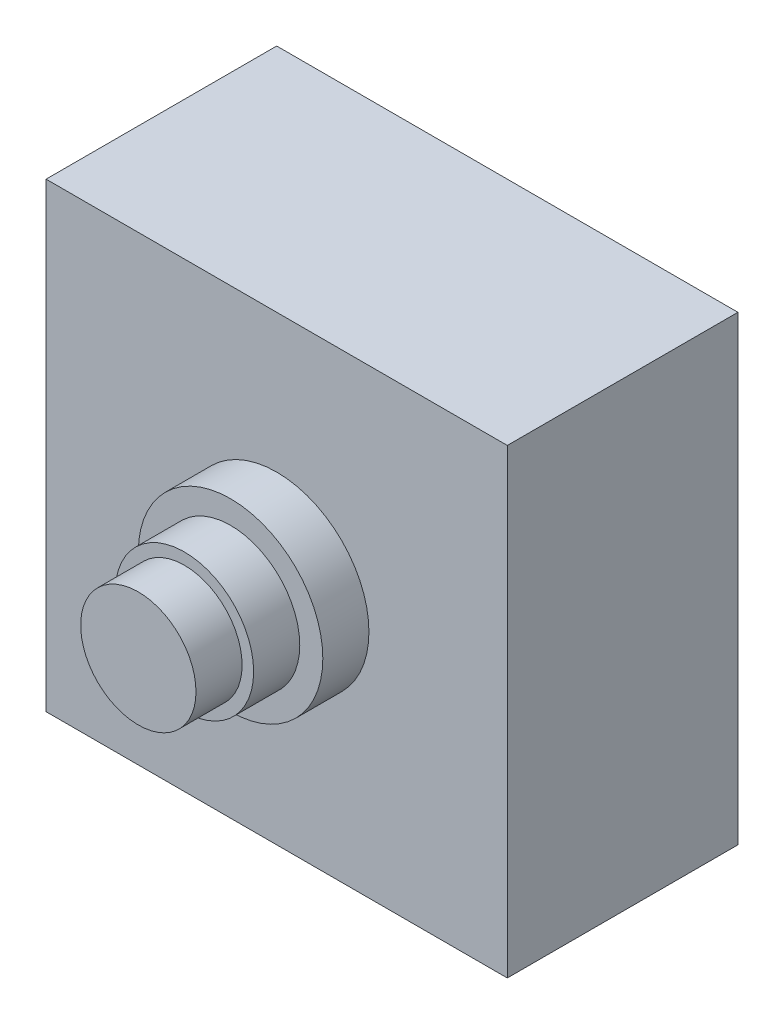
ISO-10303-21;
HEADER;
FILE_DESCRIPTION(('STEP AP214'),'2;1');
FILE_NAME('part.step','',(''),(''),'','','');
FILE_SCHEMA(('AUTOMOTIVE_DESIGN { 1 0 10303 214 1 1 1 1 }'));
ENDSEC;
DATA;
#1=APPLICATION_CONTEXT('core data for automotive mechanical design processes');
#2=APPLICATION_PROTOCOL_DEFINITION('international standard','automotive_design',2000,#1);
#3=PRODUCT_CONTEXT('',#1,'mechanical');
#4=PRODUCT('Part','Part','',(#3));
#5=PRODUCT_RELATED_PRODUCT_CATEGORY('part','',(#4));
#6=PRODUCT_DEFINITION_FORMATION('','',#4);
#7=PRODUCT_DEFINITION_CONTEXT('part definition',#1,'design');
#8=PRODUCT_DEFINITION('design','',#6,#7);
#9=PRODUCT_DEFINITION_SHAPE('','',#8);
#10=(LENGTH_UNIT() NAMED_UNIT(*) SI_UNIT(.MILLI.,.METRE.));
#11=(NAMED_UNIT(*) PLANE_ANGLE_UNIT() SI_UNIT($,.RADIAN.));
#12=(NAMED_UNIT(*) SI_UNIT($,.STERADIAN.) SOLID_ANGLE_UNIT());
#13=UNCERTAINTY_MEASURE_WITH_UNIT(LENGTH_MEASURE(1.E-05),#10,'distance_accuracy_value','');
#14=(GEOMETRIC_REPRESENTATION_CONTEXT(3) GLOBAL_UNCERTAINTY_ASSIGNED_CONTEXT((#13)) GLOBAL_UNIT_ASSIGNED_CONTEXT((#10,
#11,#12)) REPRESENTATION_CONTEXT('',''));
#15=CARTESIAN_POINT('',(0.,0.,0.));
#16=DIRECTION('',(0.,0.,1.));
#17=DIRECTION('',(1.,0.,0.));
#18=AXIS2_PLACEMENT_3D('',#15,#16,#17);
#19=CARTESIAN_POINT('',(100.,-100.,100.));
#20=DIRECTION('',(-1.,0.,0.));
#21=DIRECTION('',(0.,0.,1.));
#22=AXIS2_PLACEMENT_3D('',#19,#20,#21);
#23=PLANE('',#22);
#24=DIRECTION('',(0.,1.,0.));
#25=VECTOR('',#24,1.);
#26=CARTESIAN_POINT('',(100.,-100.,0.));
#27=LINE('',#26,#25);
#28=CARTESIAN_POINT('',(100.,-100.,0.));
#29=VERTEX_POINT('',#28);
#30=CARTESIAN_POINT('',(100.,100.,0.));
#31=VERTEX_POINT('',#30);
#32=EDGE_CURVE('E106',#29,#31,#27,.T.);
#33=ORIENTED_EDGE('',*,*,#32,.T.);
#34=DIRECTION('',(0.,0.,-1.));
#35=VECTOR('',#34,1.);
#36=CARTESIAN_POINT('',(100.,100.,100.));
#37=LINE('',#36,#35);
#38=CARTESIAN_POINT('',(100.,100.,100.));
#39=VERTEX_POINT('',#38);
#40=EDGE_CURVE('E45',#39,#31,#37,.T.);
#41=ORIENTED_EDGE('',*,*,#40,.F.);
#42=DIRECTION('',(0.,1.,0.));
#43=VECTOR('',#42,1.);
#44=CARTESIAN_POINT('',(100.,-100.,100.));
#45=LINE('',#44,#43);
#46=CARTESIAN_POINT('',(100.,-100.,100.));
#47=VERTEX_POINT('',#46);
#48=EDGE_CURVE('E91',#47,#39,#45,.T.);
#49=ORIENTED_EDGE('',*,*,#48,.F.);
#50=DIRECTION('',(0.,0.,-1.));
#51=VECTOR('',#50,1.);
#52=CARTESIAN_POINT('',(100.,-100.,100.));
#53=LINE('',#52,#51);
#54=EDGE_CURVE('E105',#47,#29,#53,.T.);
#55=ORIENTED_EDGE('',*,*,#54,.T.);
#56=EDGE_LOOP('',(#33,#41,#49,#55));
#57=FACE_BOUND('',#56,.T.);
#58=ADVANCED_FACE('F39',(#57),#23,.F.);
#59=CARTESIAN_POINT('',(-100.,100.,100.));
#60=DIRECTION('',(0.,-1.,0.));
#61=DIRECTION('',(0.,0.,-1.));
#62=AXIS2_PLACEMENT_3D('',#59,#60,#61);
#63=PLANE('',#62);
#64=DIRECTION('',(-1.,0.,0.));
#65=VECTOR('',#64,1.);
#66=CARTESIAN_POINT('',(-100.,100.,0.));
#67=LINE('',#66,#65);
#68=CARTESIAN_POINT('',(-100.,100.,0.));
#69=VERTEX_POINT('',#68);
#70=EDGE_CURVE('E98',#31,#69,#67,.T.);
#71=ORIENTED_EDGE('',*,*,#70,.T.);
#72=DIRECTION('',(0.,0.,-1.));
#73=VECTOR('',#72,1.);
#74=CARTESIAN_POINT('',(-100.,100.,100.));
#75=LINE('',#74,#73);
#76=CARTESIAN_POINT('',(-100.,100.,100.));
#77=VERTEX_POINT('',#76);
#78=EDGE_CURVE('E96',#77,#69,#75,.T.);
#79=ORIENTED_EDGE('',*,*,#78,.F.);
#80=DIRECTION('',(-1.,0.,0.));
#81=VECTOR('',#80,1.);
#82=CARTESIAN_POINT('',(-100.,100.,100.));
#83=LINE('',#82,#81);
#84=EDGE_CURVE('E86',#39,#77,#83,.T.);
#85=ORIENTED_EDGE('',*,*,#84,.F.);
#86=ORIENTED_EDGE('',*,*,#40,.T.);
#87=EDGE_LOOP('',(#71,#79,#85,#86));
#88=FACE_BOUND('',#87,.T.);
#89=ADVANCED_FACE('F100',(#88),#63,.F.);
#90=CARTESIAN_POINT('',(-100.,-100.,100.));
#91=DIRECTION('',(1.,0.,0.));
#92=DIRECTION('',(0.,0.,-1.));
#93=AXIS2_PLACEMENT_3D('',#90,#91,#92);
#94=PLANE('',#93);
#95=DIRECTION('',(0.,-1.,0.));
#96=VECTOR('',#95,1.);
#97=CARTESIAN_POINT('',(-100.,-100.,0.));
#98=LINE('',#97,#96);
#99=CARTESIAN_POINT('',(-100.,-100.,0.));
#100=VERTEX_POINT('',#99);
#101=EDGE_CURVE('E74',#69,#100,#98,.T.);
#102=ORIENTED_EDGE('',*,*,#101,.T.);
#103=DIRECTION('',(0.,0.,-1.));
#104=VECTOR('',#103,1.);
#105=CARTESIAN_POINT('',(-100.,-100.,100.));
#106=LINE('',#105,#104);
#107=CARTESIAN_POINT('',(-100.,-100.,100.));
#108=VERTEX_POINT('',#107);
#109=EDGE_CURVE('E97',#108,#100,#106,.T.);
#110=ORIENTED_EDGE('',*,*,#109,.F.);
#111=DIRECTION('',(0.,-1.,0.));
#112=VECTOR('',#111,1.);
#113=CARTESIAN_POINT('',(-100.,-100.,100.));
#114=LINE('',#113,#112);
#115=EDGE_CURVE('E93',#77,#108,#114,.T.);
#116=ORIENTED_EDGE('',*,*,#115,.F.);
#117=ORIENTED_EDGE('',*,*,#78,.T.);
#118=EDGE_LOOP('',(#102,#110,#116,#117));
#119=FACE_BOUND('',#118,.T.);
#120=ADVANCED_FACE('F99',(#119),#94,.F.);
#121=CARTESIAN_POINT('',(-100.,-100.,100.));
#122=DIRECTION('',(0.,1.,0.));
#123=DIRECTION('',(0.,0.,1.));
#124=AXIS2_PLACEMENT_3D('',#121,#122,#123);
#125=PLANE('',#124);
#126=DIRECTION('',(1.,0.,0.));
#127=VECTOR('',#126,1.);
#128=CARTESIAN_POINT('',(-100.,-100.,0.));
#129=LINE('',#128,#127);
#130=EDGE_CURVE('E76',#100,#29,#129,.T.);
#131=ORIENTED_EDGE('',*,*,#130,.T.);
#132=ORIENTED_EDGE('',*,*,#54,.F.);
#133=DIRECTION('',(1.,0.,0.));
#134=VECTOR('',#133,1.);
#135=CARTESIAN_POINT('',(-100.,-100.,100.));
#136=LINE('',#135,#134);
#137=EDGE_CURVE('E60',#108,#47,#136,.T.);
#138=ORIENTED_EDGE('',*,*,#137,.F.);
#139=ORIENTED_EDGE('',*,*,#109,.T.);
#140=EDGE_LOOP('',(#131,#132,#138,#139));
#141=FACE_BOUND('',#140,.T.);
#142=ADVANCED_FACE('F111',(#141),#125,.F.);
#143=CARTESIAN_POINT('',(0.,0.,100.));
#144=DIRECTION('',(0.,0.,-1.));
#145=DIRECTION('',(-1.,0.,0.));
#146=AXIS2_PLACEMENT_3D('',#143,#144,#145);
#147=PLANE('',#146);
#148=CARTESIAN_POINT('',(0.,0.,100.));
#149=DIRECTION('',(0.,0.,1.));
#150=DIRECTION('',(1.,0.,0.));
#151=AXIS2_PLACEMENT_3D('',#148,#149,#150);
#152=CIRCLE('',#151,40.);
#153=CARTESIAN_POINT('',(40.,0.,100.));
#154=VERTEX_POINT('',#153);
#155=EDGE_CURVE('E116',#154,#154,#152,.T.);
#156=ORIENTED_EDGE('',*,*,#155,.F.);
#157=EDGE_LOOP('',(#156));
#158=FACE_BOUND('',#157,.T.);
#159=ORIENTED_EDGE('',*,*,#48,.T.);
#160=ORIENTED_EDGE('',*,*,#84,.T.);
#161=ORIENTED_EDGE('',*,*,#115,.T.);
#162=ORIENTED_EDGE('',*,*,#137,.T.);
#163=EDGE_LOOP('',(#159,#160,#161,#162));
#164=FACE_BOUND('',#163,.T.);
#165=ADVANCED_FACE('F90',(#158,#164),#147,.F.);
#166=CARTESIAN_POINT('',(0.,0.,0.));
#167=DIRECTION('',(0.,0.,-1.));
#168=DIRECTION('',(-1.,0.,0.));
#169=AXIS2_PLACEMENT_3D('',#166,#167,#168);
#170=PLANE('',#169);
#171=ORIENTED_EDGE('',*,*,#32,.F.);
#172=ORIENTED_EDGE('',*,*,#130,.F.);
#173=ORIENTED_EDGE('',*,*,#101,.F.);
#174=ORIENTED_EDGE('',*,*,#70,.F.);
#175=EDGE_LOOP('',(#171,#172,#173,#174));
#176=FACE_BOUND('',#175,.T.);
#177=ADVANCED_FACE('F119',(#176),#170,.T.);
#178=CARTESIAN_POINT('',(0.,0.,120.));
#179=DIRECTION('',(0.,0.,-1.));
#180=DIRECTION('',(-1.,0.,0.));
#181=AXIS2_PLACEMENT_3D('',#178,#179,#180);
#182=CYLINDRICAL_SURFACE('',#181,40.);
#183=CARTESIAN_POINT('',(0.,0.,120.));
#184=DIRECTION('',(0.,0.,1.));
#185=DIRECTION('',(1.,0.,0.));
#186=AXIS2_PLACEMENT_3D('',#183,#184,#185);
#187=CIRCLE('',#186,40.);
#188=CARTESIAN_POINT('',(40.,0.,120.));
#189=VERTEX_POINT('',#188);
#190=EDGE_CURVE('E108',#189,#189,#187,.T.);
#191=ORIENTED_EDGE('',*,*,#190,.F.);
#192=EDGE_LOOP('',(#191));
#193=FACE_BOUND('',#192,.T.);
#194=ORIENTED_EDGE('',*,*,#155,.T.);
#195=EDGE_LOOP('',(#194));
#196=FACE_BOUND('',#195,.T.);
#197=ADVANCED_FACE('F160',(#193,#196),#182,.T.);
#198=CARTESIAN_POINT('',(0.,0.,120.));
#199=DIRECTION('',(0.,0.,1.));
#200=DIRECTION('',(1.,0.,0.));
#201=AXIS2_PLACEMENT_3D('',#198,#199,#200);
#202=PLANE('',#201);
#203=CARTESIAN_POINT('',(0.,0.,120.));
#204=DIRECTION('',(0.,0.,1.));
#205=DIRECTION('',(1.,0.,0.));
#206=AXIS2_PLACEMENT_3D('',#203,#204,#205);
#207=CIRCLE('',#206,30.);
#208=CARTESIAN_POINT('',(30.,0.,120.));
#209=VERTEX_POINT('',#208);
#210=EDGE_CURVE('E48',#209,#209,#207,.T.);
#211=ORIENTED_EDGE('',*,*,#210,.F.);
#212=EDGE_LOOP('',(#211));
#213=FACE_BOUND('',#212,.T.);
#214=ORIENTED_EDGE('',*,*,#190,.T.);
#215=EDGE_LOOP('',(#214));
#216=FACE_BOUND('',#215,.T.);
#217=ADVANCED_FACE('F151',(#213,#216),#202,.T.);
#218=CARTESIAN_POINT('',(0.,0.,140.));
#219=DIRECTION('',(0.,0.,-1.));
#220=DIRECTION('',(-1.,0.,0.));
#221=AXIS2_PLACEMENT_3D('',#218,#219,#220);
#222=CYLINDRICAL_SURFACE('',#221,30.);
#223=CARTESIAN_POINT('',(0.,0.,140.));
#224=DIRECTION('',(0.,0.,1.));
#225=DIRECTION('',(1.,0.,0.));
#226=AXIS2_PLACEMENT_3D('',#223,#224,#225);
#227=CIRCLE('',#226,30.);
#228=CARTESIAN_POINT('',(30.,0.,140.));
#229=VERTEX_POINT('',#228);
#230=EDGE_CURVE('E122',#229,#229,#227,.T.);
#231=ORIENTED_EDGE('',*,*,#230,.F.);
#232=EDGE_LOOP('',(#231));
#233=FACE_BOUND('',#232,.T.);
#234=ORIENTED_EDGE('',*,*,#210,.T.);
#235=EDGE_LOOP('',(#234));
#236=FACE_BOUND('',#235,.T.);
#237=ADVANCED_FACE('F144',(#233,#236),#222,.T.);
#238=CARTESIAN_POINT('',(0.,0.,140.));
#239=DIRECTION('',(0.,0.,1.));
#240=DIRECTION('',(1.,0.,0.));
#241=AXIS2_PLACEMENT_3D('',#238,#239,#240);
#242=PLANE('',#241);
#243=CARTESIAN_POINT('',(0.,0.,140.));
#244=DIRECTION('',(0.,0.,1.));
#245=DIRECTION('',(1.,0.,0.));
#246=AXIS2_PLACEMENT_3D('',#243,#244,#245);
#247=CIRCLE('',#246,25.);
#248=CARTESIAN_POINT('',(25.,0.,140.));
#249=VERTEX_POINT('',#248);
#250=EDGE_CURVE('E11',#249,#249,#247,.T.);
#251=ORIENTED_EDGE('',*,*,#250,.F.);
#252=EDGE_LOOP('',(#251));
#253=FACE_BOUND('',#252,.T.);
#254=ORIENTED_EDGE('',*,*,#230,.T.);
#255=EDGE_LOOP('',(#254));
#256=FACE_BOUND('',#255,.T.);
#257=ADVANCED_FACE('F139',(#253,#256),#242,.T.);
#258=CARTESIAN_POINT('',(0.,0.,160.));
#259=DIRECTION('',(0.,0.,-1.));
#260=DIRECTION('',(-1.,0.,0.));
#261=AXIS2_PLACEMENT_3D('',#258,#259,#260);
#262=CYLINDRICAL_SURFACE('',#261,25.);
#263=CARTESIAN_POINT('',(0.,0.,160.));
#264=DIRECTION('',(0.,0.,1.));
#265=DIRECTION('',(1.,0.,0.));
#266=AXIS2_PLACEMENT_3D('',#263,#264,#265);
#267=CIRCLE('',#266,25.);
#268=CARTESIAN_POINT('',(25.,0.,160.));
#269=VERTEX_POINT('',#268);
#270=EDGE_CURVE('E129',#269,#269,#267,.T.);
#271=ORIENTED_EDGE('',*,*,#270,.F.);
#272=EDGE_LOOP('',(#271));
#273=FACE_BOUND('',#272,.T.);
#274=ORIENTED_EDGE('',*,*,#250,.T.);
#275=EDGE_LOOP('',(#274));
#276=FACE_BOUND('',#275,.T.);
#277=ADVANCED_FACE('F138',(#273,#276),#262,.T.);
#278=CARTESIAN_POINT('',(0.,0.,160.));
#279=DIRECTION('',(0.,0.,1.));
#280=DIRECTION('',(1.,0.,0.));
#281=AXIS2_PLACEMENT_3D('',#278,#279,#280);
#282=PLANE('',#281);
#283=ORIENTED_EDGE('',*,*,#270,.T.);
#284=EDGE_LOOP('',(#283));
#285=FACE_BOUND('',#284,.T.);
#286=ADVANCED_FACE('F135',(#285),#282,.T.);
#287=CLOSED_SHELL('',(#58,#89,#120,#142,#165,#177,#197,#217,#237,#257,#277,#286));
#288=MANIFOLD_SOLID_BREP('B2',#287);
#289=ADVANCED_BREP_SHAPE_REPRESENTATION('',(#18,#288),#14);
#290=SHAPE_DEFINITION_REPRESENTATION(#9,#289);
ENDSEC;
END-ISO-10303-21;
